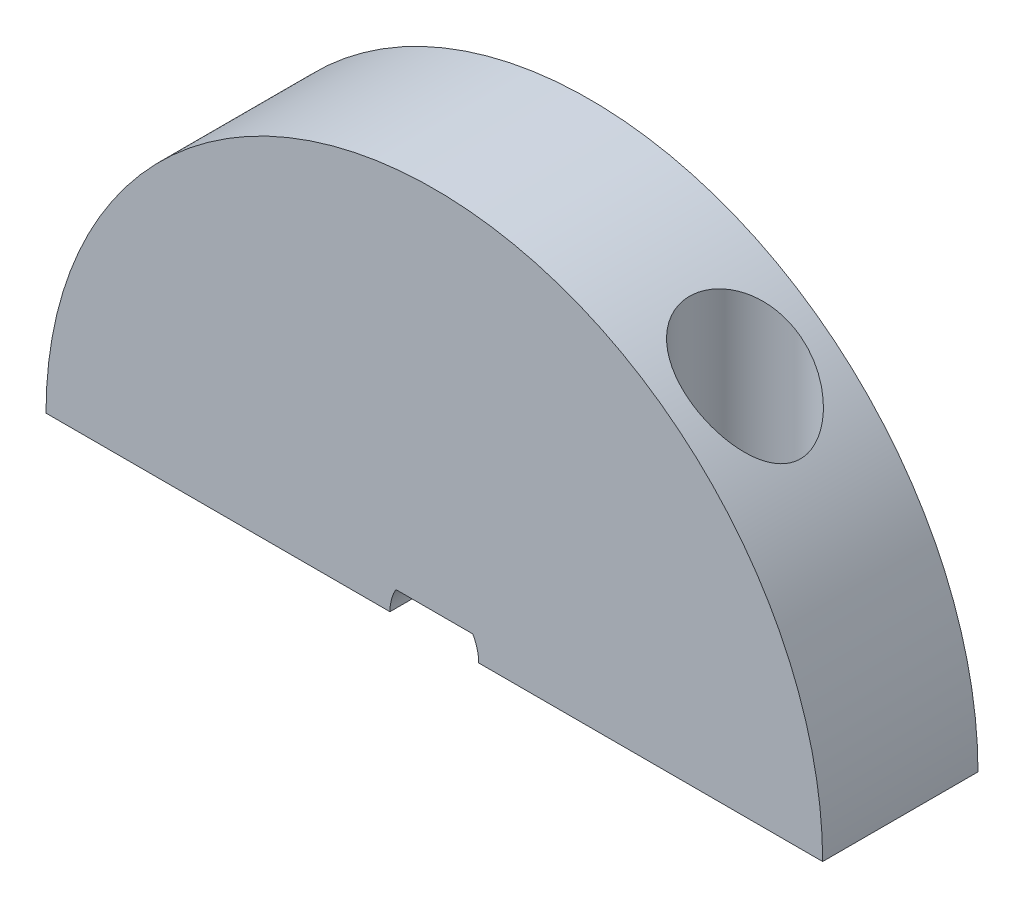
ISO-10303-21;
HEADER;
FILE_DESCRIPTION(('STEP AP214'),'2;1');
FILE_NAME('part.step','',(''),(''),'','','');
FILE_SCHEMA(('AUTOMOTIVE_DESIGN { 1 0 10303 214 1 1 1 1 }'));
ENDSEC;
DATA;
#1=APPLICATION_CONTEXT('core data for automotive mechanical design processes');
#2=APPLICATION_PROTOCOL_DEFINITION('international standard','automotive_design',2000,#1);
#3=PRODUCT_CONTEXT('',#1,'mechanical');
#4=PRODUCT('Part','Part','',(#3));
#5=PRODUCT_RELATED_PRODUCT_CATEGORY('part','',(#4));
#6=PRODUCT_DEFINITION_FORMATION('','',#4);
#7=PRODUCT_DEFINITION_CONTEXT('part definition',#1,'design');
#8=PRODUCT_DEFINITION('design','',#6,#7);
#9=PRODUCT_DEFINITION_SHAPE('','',#8);
#10=(LENGTH_UNIT() NAMED_UNIT(*) SI_UNIT(.MILLI.,.METRE.));
#11=(NAMED_UNIT(*) PLANE_ANGLE_UNIT() SI_UNIT($,.RADIAN.));
#12=(NAMED_UNIT(*) SI_UNIT($,.STERADIAN.) SOLID_ANGLE_UNIT());
#13=UNCERTAINTY_MEASURE_WITH_UNIT(LENGTH_MEASURE(1.E-05),#10,'distance_accuracy_value','');
#14=(GEOMETRIC_REPRESENTATION_CONTEXT(3) GLOBAL_UNCERTAINTY_ASSIGNED_CONTEXT((#13)) GLOBAL_UNIT_ASSIGNED_CONTEXT((#10,
#11,#12)) REPRESENTATION_CONTEXT('',''));
#15=CARTESIAN_POINT('',(0.,0.,0.));
#16=DIRECTION('',(0.,0.,1.));
#17=DIRECTION('',(1.,0.,0.));
#18=AXIS2_PLACEMENT_3D('',#15,#16,#17);
#19=CARTESIAN_POINT('',(0.,0.,5.));
#20=DIRECTION('',(0.,1.,0.));
#21=DIRECTION('',(0.,0.,1.));
#22=AXIS2_PLACEMENT_3D('',#19,#20,#21);
#23=PLANE('',#22);
#24=CARTESIAN_POINT('',(10.5,0.,1.5));
#25=DIRECTION('',(0.,-1.,0.));
#26=DIRECTION('',(0.,0.,-1.));
#27=AXIS2_PLACEMENT_3D('',#24,#25,#26);
#28=CIRCLE('',#27,2.5);
#29=CARTESIAN_POINT('',(10.5,0.,-1.));
#30=VERTEX_POINT('',#29);
#31=EDGE_CURVE('E123',#30,#30,#28,.T.);
#32=ORIENTED_EDGE('',*,*,#31,.F.);
#33=EDGE_LOOP('',(#32));
#34=FACE_BOUND('',#33,.T.);
#35=DIRECTION('',(0.,0.,-1.));
#36=VECTOR('',#35,1.);
#37=CARTESIAN_POINT('',(2.,0.,5.));
#38=LINE('',#37,#36);
#39=CARTESIAN_POINT('',(2.,0.,5.));
#40=VERTEX_POINT('',#39);
#41=CARTESIAN_POINT('',(2.,0.,-2.));
#42=VERTEX_POINT('',#41);
#43=EDGE_CURVE('E59',#40,#42,#38,.T.);
#44=ORIENTED_EDGE('',*,*,#43,.T.);
#45=DIRECTION('',(-1.,0.,0.));
#46=VECTOR('',#45,1.);
#47=CARTESIAN_POINT('',(0.,0.,-2.));
#48=LINE('',#47,#46);
#49=CARTESIAN_POINT('',(17.5,0.,-2.));
#50=VERTEX_POINT('',#49);
#51=EDGE_CURVE('E116',#50,#42,#48,.T.);
#52=ORIENTED_EDGE('',*,*,#51,.F.);
#53=DIRECTION('',(0.,0.,-1.));
#54=VECTOR('',#53,1.);
#55=CARTESIAN_POINT('',(17.5,0.,5.));
#56=LINE('',#55,#54);
#57=CARTESIAN_POINT('',(17.5,0.,5.));
#58=VERTEX_POINT('',#57);
#59=EDGE_CURVE('E51',#58,#50,#56,.T.);
#60=ORIENTED_EDGE('',*,*,#59,.F.);
#61=DIRECTION('',(1.,0.,0.));
#62=VECTOR('',#61,1.);
#63=CARTESIAN_POINT('',(0.,0.,5.));
#64=LINE('',#63,#62);
#65=EDGE_CURVE('E129',#40,#58,#64,.T.);
#66=ORIENTED_EDGE('',*,*,#65,.F.);
#67=EDGE_LOOP('',(#44,#52,#60,#66));
#68=FACE_BOUND('',#67,.T.);
#69=ADVANCED_FACE('F38',(#34,#68),#23,.F.);
#70=CARTESIAN_POINT('',(0.,0.,5.));
#71=DIRECTION('',(0.,0.,-1.));
#72=DIRECTION('',(-1.,0.,0.));
#73=AXIS2_PLACEMENT_3D('',#70,#71,#72);
#74=CYLINDRICAL_SURFACE('',#73,17.5);
#75=CARTESIAN_POINT('',(10.5,14.,-1.));
#76=CARTESIAN_POINT('',(10.6693230555787,13.8730035055793,-1.0000016352744));
#77=CARTESIAN_POINT('',(10.8363611731034,13.7428890883798,-0.982820948631325));
#78=CARTESIAN_POINT('',(11.1620383708418,13.4797194890011,-0.916484977652637));
#79=CARTESIAN_POINT('',(11.3206602227136,13.3466590093686,-0.867266650338043));
#80=CARTESIAN_POINT('',(11.5545008539908,13.1436366315808,-0.768438454367837));
#81=CARTESIAN_POINT('',(11.6340869679816,13.0732155909724,-0.72973697400391));
#82=CARTESIAN_POINT('',(11.7894012894902,12.933325852313,-0.643671841407805));
#83=CARTESIAN_POINT('',(11.8651285961072,12.8638573793963,-0.59630617812158));
#84=CARTESIAN_POINT('',(12.0120203035548,12.7268002995096,-0.492949771699154));
#85=CARTESIAN_POINT('',(12.0831915342044,12.6592089690166,-0.436972388149344));
#86=CARTESIAN_POINT('',(12.22038889146,12.5268184766452,-0.316207114074774));
#87=CARTESIAN_POINT('',(12.2864179487222,12.4620177338944,-0.251424300654024));
#88=CARTESIAN_POINT('',(12.4290195843983,12.3199852665967,-0.094637242040607));
#89=CARTESIAN_POINT('',(12.5038462643344,12.2439231612622,5.87841243523138E-05));
#90=CARTESIAN_POINT('',(12.6415773251657,12.1016651981894,0.204326186316351));
#91=CARTESIAN_POINT('',(12.7045022298258,12.0354523989296,0.313871385349282));
#92=CARTESIAN_POINT('',(12.8028601001329,11.9306647299672,0.521755813628883));
#93=CARTESIAN_POINT('',(12.8412953051854,11.889216553179,0.61720383534389));
#94=CARTESIAN_POINT('',(12.9068972896313,11.8179675498429,0.816058430703008));
#95=CARTESIAN_POINT('',(12.9340732397431,11.7881572453378,0.919458445690622));
#96=CARTESIAN_POINT('',(12.9753233488609,11.7427409325516,1.13300490566541));
#97=CARTESIAN_POINT('',(12.9892744484606,11.7272683685451,1.24320474532851));
#98=CARTESIAN_POINT('',(13.0022349070161,11.7128988961006,1.46553180838855));
#99=CARTESIAN_POINT('',(13.0012555614562,11.7139894569879,1.57765751064734));
#100=CARTESIAN_POINT('',(12.9856894682484,11.7312382462987,1.78374398965684));
#101=CARTESIAN_POINT('',(12.9730303946788,11.7452618137948,1.87804690429587));
#102=CARTESIAN_POINT('',(12.9377233255306,11.7841419536152,2.06243058588766));
#103=CARTESIAN_POINT('',(12.9150703198579,11.8090039593219,2.15250921005719));
#104=CARTESIAN_POINT('',(12.8521484906218,11.877502612602,2.35564533238325));
#105=CARTESIAN_POINT('',(12.8085338482652,11.9246269854825,2.46648297337034));
#106=CARTESIAN_POINT('',(12.7090073410929,12.0306457476111,2.67637069429108));
#107=CARTESIAN_POINT('',(12.6530704688397,12.0895640496048,2.77539616269664));
#108=CARTESIAN_POINT('',(12.5070994711457,12.2408081513281,2.9985831345722));
#109=CARTESIAN_POINT('',(12.412370584185,12.3370774481468,3.11698427561115));
#110=CARTESIAN_POINT('',(12.2084608858717,12.5389081240049,3.33114269562967));
#111=CARTESIAN_POINT('',(12.099256101501,12.6444848173778,3.4268616620831));
#112=CARTESIAN_POINT('',(11.8392187730149,12.8888477518641,3.61872399469626));
#113=CARTESIAN_POINT('',(11.6849753455386,13.0290886288363,3.70841013720879));
#114=CARTESIAN_POINT('',(11.3624566809274,13.3112962792632,3.85317095796061));
#115=CARTESIAN_POINT('',(11.194173136429,13.4532640314458,3.90822497792837));
#116=CARTESIAN_POINT('',(10.8466776827386,13.734985194969,3.98223820455316));
#117=CARTESIAN_POINT('',(10.6674198319007,13.8747257031516,4.00103320191378));
#118=CARTESIAN_POINT('',(10.3037362611311,14.1468840450346,3.99888363343784));
#119=CARTESIAN_POINT('',(10.1193194088438,14.2793134049036,3.97800357064157));
#120=CARTESIAN_POINT('',(9.79586048819215,14.5024217222146,3.90309620768234));
#121=CARTESIAN_POINT('',(9.65640879200539,14.5955642533284,3.85808293888247));
#122=CARTESIAN_POINT('',(9.3827942713,14.7729349731376,3.74140349200461));
#123=CARTESIAN_POINT('',(9.2486296157144,14.8571662654054,3.66974663276828));
#124=CARTESIAN_POINT('',(9.05517145441867,14.9753039674369,3.54170207717697));
#125=CARTESIAN_POINT('',(8.99170753460297,15.0134726587736,3.49533029910775));
#126=CARTESIAN_POINT('',(8.86838866581365,15.0866430177279,3.39581402359019));
#127=CARTESIAN_POINT('',(8.80853176753403,15.1216464011553,3.34267323349027));
#128=CARTESIAN_POINT('',(8.69328200991433,15.1881954739684,3.22981793581624));
#129=CARTESIAN_POINT('',(8.63788767014231,15.2197423113073,3.17010562399612));
#130=CARTESIAN_POINT('',(8.53243806534632,15.2791087184906,3.04448533342454));
#131=CARTESIAN_POINT('',(8.48238172357917,15.3069290403125,2.9785786092314));
#132=CARTESIAN_POINT('',(8.35487150028068,15.3770793104241,2.79180568055902));
#133=CARTESIAN_POINT('',(8.28336740973211,15.4155903838016,2.66529127360303));
#134=CARTESIAN_POINT('',(8.16272196563949,15.4798161378617,2.39914521986531));
#135=CARTESIAN_POINT('',(8.11356161528239,15.505541690635,2.25952483821126));
#136=CARTESIAN_POINT('',(8.04476539851738,15.5413340530648,1.98887300806376));
#137=CARTESIAN_POINT('',(8.02235606697431,15.5528765299304,1.8587373423943));
#138=CARTESIAN_POINT('',(7.99837250123543,15.5652252149785,1.59607692934752));
#139=CARTESIAN_POINT('',(7.99679024998357,15.5660355543289,1.46355312092032));
#140=CARTESIAN_POINT('',(8.01409006711534,15.5571344871716,1.20671292928975));
#141=CARTESIAN_POINT('',(8.0319826940875,15.5479318102167,1.08231036252547));
#142=CARTESIAN_POINT('',(8.0858455484668,15.5199875406474,0.838616455989379));
#143=CARTESIAN_POINT('',(8.12181488551679,15.5012464178427,0.719324864793665));
#144=CARTESIAN_POINT('',(8.21061608098594,15.4543944022805,0.487967544306255));
#145=CARTESIAN_POINT('',(8.26359026263401,15.4262043346226,0.375972760721606));
#146=CARTESIAN_POINT('',(8.38406428870482,15.3610592326632,0.162911821541665));
#147=CARTESIAN_POINT('',(8.45156663676333,15.3241026875243,0.0618475541159043));
#148=CARTESIAN_POINT('',(8.60285907918463,15.2397090096064,-0.133084048930238));
#149=CARTESIAN_POINT('',(8.68737619476909,15.191781417769,-0.226172613667525));
#150=CARTESIAN_POINT('',(8.86661120947417,15.0878739009523,-0.39667118723182));
#151=CARTESIAN_POINT('',(8.96133309772896,15.031890824123,-0.474075030453931));
#152=CARTESIAN_POINT('',(9.16861022593447,14.9064675800351,-0.620182466926158));
#153=CARTESIAN_POINT('',(9.28198519990648,14.836226319729,-0.687029977594648));
#154=CARTESIAN_POINT('',(9.51385755929162,14.6886156779839,-0.800919540383731));
#155=CARTESIAN_POINT('',(9.6323567083407,14.6112438318104,-0.847954712706855));
#156=CARTESIAN_POINT('',(9.87605965365903,14.4476914685871,-0.924382413746074));
#157=CARTESIAN_POINT('',(10.0013457611372,14.3612863001601,-0.953024473289765));
#158=CARTESIAN_POINT('',(10.2514941329313,14.1838091849957,-0.990835535306657));
#159=CARTESIAN_POINT('',(10.3763562616972,14.0927358726658,-0.999998805883587));
#160=CARTESIAN_POINT('',(10.5,14.,-1.));
#161=B_SPLINE_CURVE_WITH_KNOTS('',3,(#75,#76,#77,#78,#79,#80,#81,#82,#83,#84,#85,#86,#87,#88,
#89,#90,#91,#92,#93,#94,#95,#96,#97,#98,#99,#100,#101,#102,#103,#104,#105,#106,#107,#108,#109,
#110,#111,#112,#113,#114,#115,#116,#117,#118,#119,#120,#121,#122,#123,#124,#125,#126,#127,#128,
#129,#130,#131,#132,#133,#134,#135,#136,#137,#138,#139,#140,#141,#142,#143,#144,#145,#146,#147,
#148,#149,#150,#151,#152,#153,#154,#155,#156,#157,#158,#159,#160),.UNSPECIFIED.,.T.,.F.,(4,2,2,
2,2,2,2,2,2,2,2,2,2,2,2,2,2,2,2,2,2,2,2,2,2,2,2,2,2,2,2,2,2,2,2,2,2,2,2,2,2,2,4),(0.,
0.634472384308315,1.27019705942767,1.60915402886446,1.94818977407963,2.28670477144107,
2.62502540665639,3.05164478737499,3.47752164881237,3.80908052640154,4.14036881421213,
4.47471037956528,4.80879901459162,5.09603238886687,5.38340992105232,5.76556940901357,
6.14851173805806,6.68442334560445,7.22123381150525,7.89866577359558,8.57650144573758,
9.25739974892904,9.93719200627522,10.4561053146142,10.9748372986986,11.2366438990374,
11.4983077210505,11.7598843768096,12.0214081689733,12.4696190755632,12.9174481937973,
13.3130784667791,13.7085564436723,14.0848412038336,14.4611074321386,14.8406087586791,
15.220175537041,15.6221833150365,16.0243488155152,16.4701632788945,16.9161324231465,
17.379303032847,17.8426099178878),.UNSPECIFIED.);
#162=CARTESIAN_POINT('',(10.5,14.,-1.));
#163=VERTEX_POINT('',#162);
#164=EDGE_CURVE('E41',#163,#163,#161,.T.);
#165=ORIENTED_EDGE('',*,*,#164,.T.);
#166=EDGE_LOOP('',(#165));
#167=FACE_BOUND('',#166,.T.);
#168=ORIENTED_EDGE('',*,*,#59,.T.);
#169=CARTESIAN_POINT('',(0.,0.,-2.));
#170=DIRECTION('',(0.,0.,-1.));
#171=DIRECTION('',(-1.,0.,0.));
#172=AXIS2_PLACEMENT_3D('',#169,#170,#171);
#173=CIRCLE('',#172,17.5);
#174=CARTESIAN_POINT('',(-17.5,0.,-2.));
#175=VERTEX_POINT('',#174);
#176=EDGE_CURVE('E111',#175,#50,#173,.T.);
#177=ORIENTED_EDGE('',*,*,#176,.F.);
#178=DIRECTION('',(0.,0.,-1.));
#179=VECTOR('',#178,1.);
#180=CARTESIAN_POINT('',(-17.5,0.,5.));
#181=LINE('',#180,#179);
#182=CARTESIAN_POINT('',(-17.5,0.,5.));
#183=VERTEX_POINT('',#182);
#184=EDGE_CURVE('E101',#183,#175,#181,.T.);
#185=ORIENTED_EDGE('',*,*,#184,.F.);
#186=CARTESIAN_POINT('',(0.,0.,5.));
#187=DIRECTION('',(0.,0.,1.));
#188=DIRECTION('',(1.,0.,0.));
#189=AXIS2_PLACEMENT_3D('',#186,#187,#188);
#190=CIRCLE('',#189,17.5);
#191=EDGE_CURVE('E132',#58,#183,#190,.T.);
#192=ORIENTED_EDGE('',*,*,#191,.F.);
#193=EDGE_LOOP('',(#168,#177,#185,#192));
#194=FACE_BOUND('',#193,.T.);
#195=ADVANCED_FACE('F148',(#167,#194),#74,.T.);
#196=CARTESIAN_POINT('',(0.,0.,5.));
#197=DIRECTION('',(0.,-1.,0.));
#198=DIRECTION('',(0.,0.,-1.));
#199=AXIS2_PLACEMENT_3D('',#196,#197,#198);
#200=PLANE('',#199);
#201=CARTESIAN_POINT('',(-10.5,0.,1.5));
#202=DIRECTION('',(0.,-1.,0.));
#203=DIRECTION('',(0.,0.,-1.));
#204=AXIS2_PLACEMENT_3D('',#201,#202,#203);
#205=CIRCLE('',#204,0.500000000000001);
#206=CARTESIAN_POINT('',(-10.5,0.,0.999999999999999));
#207=VERTEX_POINT('',#206);
#208=EDGE_CURVE('E120',#207,#207,#205,.T.);
#209=ORIENTED_EDGE('',*,*,#208,.F.);
#210=EDGE_LOOP('',(#209));
#211=FACE_BOUND('',#210,.T.);
#212=ORIENTED_EDGE('',*,*,#184,.T.);
#213=DIRECTION('',(-1.,0.,0.));
#214=VECTOR('',#213,1.);
#215=CARTESIAN_POINT('',(0.,0.,-2.));
#216=LINE('',#215,#214);
#217=CARTESIAN_POINT('',(-2.,0.,-2.));
#218=VERTEX_POINT('',#217);
#219=EDGE_CURVE('E105',#218,#175,#216,.T.);
#220=ORIENTED_EDGE('',*,*,#219,.F.);
#221=DIRECTION('',(0.,0.,-1.));
#222=VECTOR('',#221,1.);
#223=CARTESIAN_POINT('',(-2.,0.,5.));
#224=LINE('',#223,#222);
#225=CARTESIAN_POINT('',(-2.,0.,5.));
#226=VERTEX_POINT('',#225);
#227=EDGE_CURVE('E90',#226,#218,#224,.T.);
#228=ORIENTED_EDGE('',*,*,#227,.F.);
#229=DIRECTION('',(-1.,0.,0.));
#230=VECTOR('',#229,1.);
#231=CARTESIAN_POINT('',(0.,0.,5.));
#232=LINE('',#231,#230);
#233=EDGE_CURVE('E134',#226,#183,#232,.T.);
#234=ORIENTED_EDGE('',*,*,#233,.T.);
#235=EDGE_LOOP('',(#212,#220,#228,#234));
#236=FACE_BOUND('',#235,.T.);
#237=ADVANCED_FACE('F106',(#211,#236),#200,.T.);
#238=CARTESIAN_POINT('',(0.,1.,5.));
#239=DIRECTION('',(0.,1.,0.));
#240=DIRECTION('',(0.,0.,1.));
#241=AXIS2_PLACEMENT_3D('',#238,#239,#240);
#242=PLANE('',#241);
#243=DIRECTION('',(1.,0.,0.));
#244=VECTOR('',#243,1.);
#245=CARTESIAN_POINT('',(0.,1.,0.));
#246=LINE('',#245,#244);
#247=CARTESIAN_POINT('',(-1.73205080756888,1.,0.));
#248=VERTEX_POINT('',#247);
#249=CARTESIAN_POINT('',(1.73205080756888,1.,0.));
#250=VERTEX_POINT('',#249);
#251=EDGE_CURVE('E127',#248,#250,#246,.T.);
#252=ORIENTED_EDGE('',*,*,#251,.T.);
#253=DIRECTION('',(0.,0.,-1.));
#254=VECTOR('',#253,1.);
#255=CARTESIAN_POINT('',(1.73205080756888,1.,5.));
#256=LINE('',#255,#254);
#257=CARTESIAN_POINT('',(1.73205080756888,1.,5.));
#258=VERTEX_POINT('',#257);
#259=EDGE_CURVE('E142',#258,#250,#256,.T.);
#260=ORIENTED_EDGE('',*,*,#259,.F.);
#261=DIRECTION('',(1.,0.,0.));
#262=VECTOR('',#261,1.);
#263=CARTESIAN_POINT('',(0.,1.,5.));
#264=LINE('',#263,#262);
#265=CARTESIAN_POINT('',(-1.73205080756888,1.,5.));
#266=VERTEX_POINT('',#265);
#267=EDGE_CURVE('E137',#266,#258,#264,.T.);
#268=ORIENTED_EDGE('',*,*,#267,.F.);
#269=DIRECTION('',(0.,0.,-1.));
#270=VECTOR('',#269,1.);
#271=CARTESIAN_POINT('',(-1.73205080756888,1.,5.));
#272=LINE('',#271,#270);
#273=EDGE_CURVE('E102',#266,#248,#272,.T.);
#274=ORIENTED_EDGE('',*,*,#273,.T.);
#275=EDGE_LOOP('',(#252,#260,#268,#274));
#276=FACE_BOUND('',#275,.T.);
#277=ADVANCED_FACE('F160',(#276),#242,.F.);
#278=CARTESIAN_POINT('',(0.,0.,5.));
#279=DIRECTION('',(0.,0.,-1.));
#280=DIRECTION('',(-1.,0.,0.));
#281=AXIS2_PLACEMENT_3D('',#278,#279,#280);
#282=CYLINDRICAL_SURFACE('',#281,2.);
#283=ORIENTED_EDGE('',*,*,#259,.T.);
#284=CARTESIAN_POINT('',(0.,0.,0.));
#285=DIRECTION('',(0.,0.,-1.));
#286=DIRECTION('',(-1.,0.,0.));
#287=AXIS2_PLACEMENT_3D('',#284,#285,#286);
#288=CIRCLE('',#287,2.);
#289=EDGE_CURVE('E11',#248,#250,#288,.T.);
#290=ORIENTED_EDGE('',*,*,#289,.F.);
#291=ORIENTED_EDGE('',*,*,#273,.F.);
#292=CARTESIAN_POINT('',(0.,0.,5.));
#293=DIRECTION('',(0.,0.,1.));
#294=DIRECTION('',(1.,0.,0.));
#295=AXIS2_PLACEMENT_3D('',#292,#293,#294);
#296=CIRCLE('',#295,2.);
#297=EDGE_CURVE('E97',#266,#226,#296,.T.);
#298=ORIENTED_EDGE('',*,*,#297,.T.);
#299=ORIENTED_EDGE('',*,*,#227,.T.);
#300=CARTESIAN_POINT('',(0.,0.,-2.));
#301=DIRECTION('',(0.,0.,-1.));
#302=DIRECTION('',(-1.,0.,0.));
#303=AXIS2_PLACEMENT_3D('',#300,#301,#302);
#304=CIRCLE('',#303,2.);
#305=EDGE_CURVE('E95',#218,#42,#304,.T.);
#306=ORIENTED_EDGE('',*,*,#305,.T.);
#307=ORIENTED_EDGE('',*,*,#43,.F.);
#308=EDGE_CURVE('E138',#40,#258,#296,.T.);
#309=ORIENTED_EDGE('',*,*,#308,.T.);
#310=EDGE_LOOP('',(#283,#290,#291,#298,#299,#306,#307,#309));
#311=FACE_BOUND('',#310,.T.);
#312=ADVANCED_FACE('F93',(#311),#282,.F.);
#313=CARTESIAN_POINT('',(0.,0.,5.));
#314=DIRECTION('',(0.,0.,1.));
#315=DIRECTION('',(1.,0.,0.));
#316=AXIS2_PLACEMENT_3D('',#313,#314,#315);
#317=PLANE('',#316);
#318=ORIENTED_EDGE('',*,*,#65,.T.);
#319=ORIENTED_EDGE('',*,*,#191,.T.);
#320=ORIENTED_EDGE('',*,*,#233,.F.);
#321=ORIENTED_EDGE('',*,*,#297,.F.);
#322=ORIENTED_EDGE('',*,*,#267,.T.);
#323=ORIENTED_EDGE('',*,*,#308,.F.);
#324=EDGE_LOOP('',(#318,#319,#320,#321,#322,#323));
#325=FACE_BOUND('',#324,.T.);
#326=ADVANCED_FACE('F152',(#325),#317,.T.);
#327=CARTESIAN_POINT('',(0.,0.,0.));
#328=DIRECTION('',(0.,0.,1.));
#329=DIRECTION('',(1.,0.,0.));
#330=AXIS2_PLACEMENT_3D('',#327,#328,#329);
#331=PLANE('',#330);
#332=ORIENTED_EDGE('',*,*,#251,.F.);
#333=ORIENTED_EDGE('',*,*,#289,.T.);
#334=EDGE_LOOP('',(#332,#333));
#335=FACE_BOUND('',#334,.T.);
#336=ADVANCED_FACE('F159',(#335),#331,.F.);
#337=CARTESIAN_POINT('',(0.,0.,-2.));
#338=DIRECTION('',(0.,0.,-1.));
#339=DIRECTION('',(-1.,0.,0.));
#340=AXIS2_PLACEMENT_3D('',#337,#338,#339);
#341=PLANE('',#340);
#342=ORIENTED_EDGE('',*,*,#305,.F.);
#343=ORIENTED_EDGE('',*,*,#219,.T.);
#344=ORIENTED_EDGE('',*,*,#176,.T.);
#345=ORIENTED_EDGE('',*,*,#51,.T.);
#346=EDGE_LOOP('',(#342,#343,#344,#345));
#347=FACE_BOUND('',#346,.T.);
#348=ADVANCED_FACE('F114',(#347),#341,.T.);
#349=CARTESIAN_POINT('',(-10.5,2.,1.5));
#350=DIRECTION('',(0.,-1.,0.));
#351=DIRECTION('',(0.,0.,-1.));
#352=AXIS2_PLACEMENT_3D('',#349,#350,#351);
#353=CYLINDRICAL_SURFACE('',#352,0.500000000000001);
#354=CARTESIAN_POINT('',(-10.5,2.,1.5));
#355=DIRECTION('',(0.,-1.,0.));
#356=DIRECTION('',(0.,0.,-1.));
#357=AXIS2_PLACEMENT_3D('',#354,#355,#356);
#358=CIRCLE('',#357,0.500000000000001);
#359=CARTESIAN_POINT('',(-10.5,2.,0.999999999999999));
#360=VERTEX_POINT('',#359);
#361=EDGE_CURVE('E117',#360,#360,#358,.T.);
#362=ORIENTED_EDGE('',*,*,#361,.F.);
#363=EDGE_LOOP('',(#362));
#364=FACE_BOUND('',#363,.T.);
#365=ORIENTED_EDGE('',*,*,#208,.T.);
#366=EDGE_LOOP('',(#365));
#367=FACE_BOUND('',#366,.T.);
#368=ADVANCED_FACE('F190',(#364,#367),#353,.F.);
#369=CARTESIAN_POINT('',(-10.5,2.,1.5));
#370=DIRECTION('',(0.,-1.,0.));
#371=DIRECTION('',(0.,0.,-1.));
#372=AXIS2_PLACEMENT_3D('',#369,#370,#371);
#373=PLANE('',#372);
#374=ORIENTED_EDGE('',*,*,#361,.T.);
#375=EDGE_LOOP('',(#374));
#376=FACE_BOUND('',#375,.T.);
#377=ADVANCED_FACE('F185',(#376),#373,.T.);
#378=CARTESIAN_POINT('',(10.5,2.,1.5));
#379=DIRECTION('',(0.,-1.,0.));
#380=DIRECTION('',(0.,0.,-1.));
#381=AXIS2_PLACEMENT_3D('',#378,#379,#380);
#382=CYLINDRICAL_SURFACE('',#381,2.5);
#383=ORIENTED_EDGE('',*,*,#31,.T.);
#384=EDGE_LOOP('',(#383));
#385=FACE_BOUND('',#384,.T.);
#386=ORIENTED_EDGE('',*,*,#164,.F.);
#387=EDGE_LOOP('',(#386));
#388=FACE_BOUND('',#387,.T.);
#389=ADVANCED_FACE('F183',(#385,#388),#382,.F.);
#390=CLOSED_SHELL('',(#69,#195,#237,#277,#312,#326,#336,#348,#368,#377,#389));
#391=MANIFOLD_SOLID_BREP('B2',#390);
#392=ADVANCED_BREP_SHAPE_REPRESENTATION('',(#18,#391),#14);
#393=SHAPE_DEFINITION_REPRESENTATION(#9,#392);
ENDSEC;
END-ISO-10303-21;
